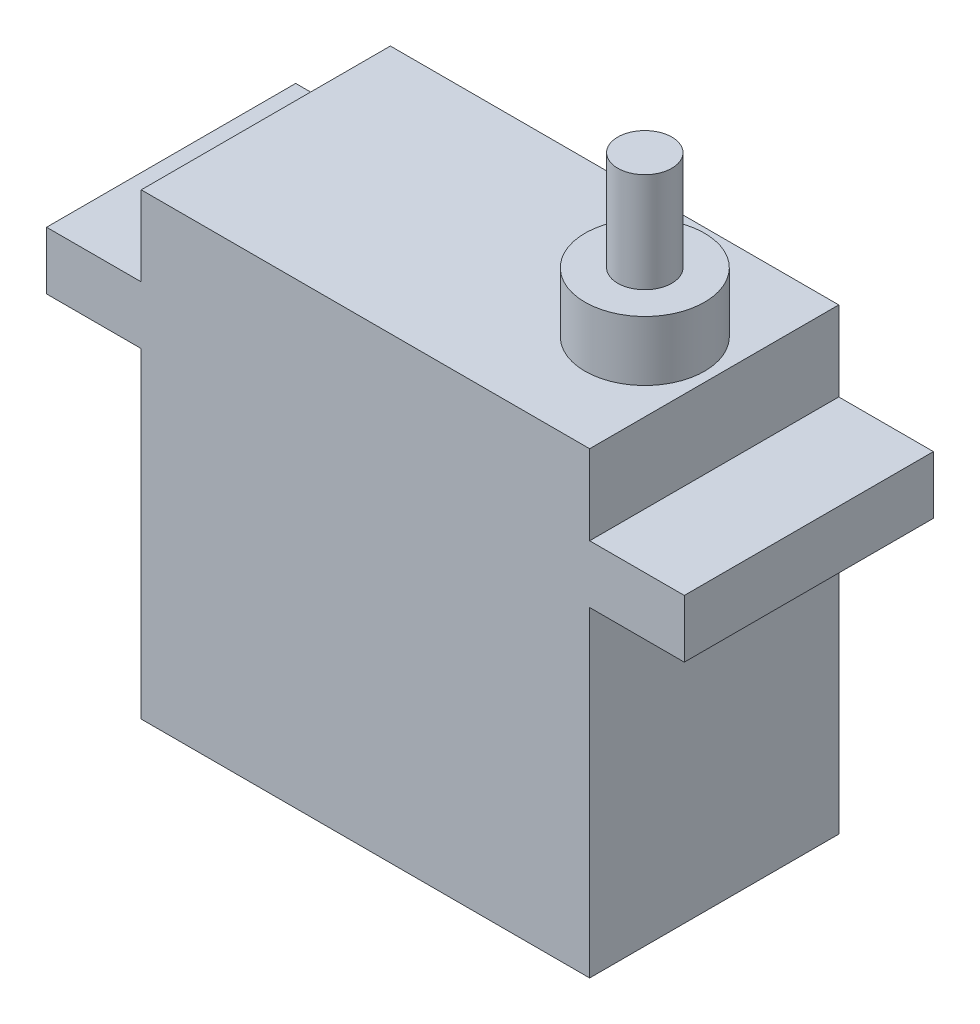
ISO-10303-21;
HEADER;
FILE_DESCRIPTION(('STEP AP214'),'2;1');
FILE_NAME('part.step','',(''),(''),'','','');
FILE_SCHEMA(('AUTOMOTIVE_DESIGN { 1 0 10303 214 1 1 1 1 }'));
ENDSEC;
DATA;
#1=APPLICATION_CONTEXT('core data for automotive mechanical design processes');
#2=APPLICATION_PROTOCOL_DEFINITION('international standard','automotive_design',2000,#1);
#3=PRODUCT_CONTEXT('',#1,'mechanical');
#4=PRODUCT('Part','Part','',(#3));
#5=PRODUCT_RELATED_PRODUCT_CATEGORY('part','',(#4));
#6=PRODUCT_DEFINITION_FORMATION('','',#4);
#7=PRODUCT_DEFINITION_CONTEXT('part definition',#1,'design');
#8=PRODUCT_DEFINITION('design','',#6,#7);
#9=PRODUCT_DEFINITION_SHAPE('','',#8);
#10=(LENGTH_UNIT() NAMED_UNIT(*) SI_UNIT(.MILLI.,.METRE.));
#11=(NAMED_UNIT(*) PLANE_ANGLE_UNIT() SI_UNIT($,.RADIAN.));
#12=(NAMED_UNIT(*) SI_UNIT($,.STERADIAN.) SOLID_ANGLE_UNIT());
#13=UNCERTAINTY_MEASURE_WITH_UNIT(LENGTH_MEASURE(1.E-05),#10,'distance_accuracy_value','');
#14=(GEOMETRIC_REPRESENTATION_CONTEXT(3) GLOBAL_UNCERTAINTY_ASSIGNED_CONTEXT((#13)) GLOBAL_UNIT_ASSIGNED_CONTEXT((#10,
#11,#12)) REPRESENTATION_CONTEXT('',''));
#15=CARTESIAN_POINT('',(0.,0.,0.));
#16=DIRECTION('',(0.,0.,1.));
#17=DIRECTION('',(1.,0.,0.));
#18=AXIS2_PLACEMENT_3D('',#15,#16,#17);
#19=CARTESIAN_POINT('',(16.,23.,6.25));
#20=DIRECTION('',(-1.,0.,0.));
#21=DIRECTION('',(0.,0.,1.));
#22=AXIS2_PLACEMENT_3D('',#19,#20,#21);
#23=PLANE('',#22);
#24=DIRECTION('',(0.,0.,1.));
#25=VECTOR('',#24,1.);
#26=CARTESIAN_POINT('',(16.,16.1,0.));
#27=LINE('',#26,#25);
#28=CARTESIAN_POINT('',(16.,16.1,-6.25));
#29=VERTEX_POINT('',#28);
#30=CARTESIAN_POINT('',(16.,16.1,6.25));
#31=VERTEX_POINT('',#30);
#32=EDGE_CURVE('E142',#29,#31,#27,.T.);
#33=ORIENTED_EDGE('',*,*,#32,.F.);
#34=DIRECTION('',(0.,-1.,0.));
#35=VECTOR('',#34,1.);
#36=CARTESIAN_POINT('',(16.,23.,-6.25));
#37=LINE('',#36,#35);
#38=CARTESIAN_POINT('',(16.,19.,-6.25));
#39=VERTEX_POINT('',#38);
#40=EDGE_CURVE('E253',#39,#29,#37,.T.);
#41=ORIENTED_EDGE('',*,*,#40,.F.);
#42=DIRECTION('',(0.,0.,-1.));
#43=VECTOR('',#42,1.);
#44=CARTESIAN_POINT('',(16.,19.,0.));
#45=LINE('',#44,#43);
#46=CARTESIAN_POINT('',(16.,19.,6.25));
#47=VERTEX_POINT('',#46);
#48=EDGE_CURVE('E221',#47,#39,#45,.T.);
#49=ORIENTED_EDGE('',*,*,#48,.F.);
#50=DIRECTION('',(0.,-1.,0.));
#51=VECTOR('',#50,1.);
#52=CARTESIAN_POINT('',(16.,23.,6.25));
#53=LINE('',#52,#51);
#54=EDGE_CURVE('E43',#47,#31,#53,.T.);
#55=ORIENTED_EDGE('',*,*,#54,.T.);
#56=EDGE_LOOP('',(#33,#41,#49,#55));
#57=FACE_BOUND('',#56,.T.);
#58=ADVANCED_FACE('F39',(#57),#23,.F.);
#59=CARTESIAN_POINT('',(-16.,23.,6.25));
#60=DIRECTION('',(-1.,0.,0.));
#61=DIRECTION('',(0.,0.,1.));
#62=AXIS2_PLACEMENT_3D('',#59,#60,#61);
#63=PLANE('',#62);
#64=DIRECTION('',(0.,-1.,0.));
#65=VECTOR('',#64,1.);
#66=CARTESIAN_POINT('',(-16.,23.,-6.25));
#67=LINE('',#66,#65);
#68=CARTESIAN_POINT('',(-16.,19.,-6.25));
#69=VERTEX_POINT('',#68);
#70=CARTESIAN_POINT('',(-16.,16.1,-6.25));
#71=VERTEX_POINT('',#70);
#72=EDGE_CURVE('E250',#69,#71,#67,.T.);
#73=ORIENTED_EDGE('',*,*,#72,.T.);
#74=DIRECTION('',(0.,0.,-1.));
#75=VECTOR('',#74,1.);
#76=CARTESIAN_POINT('',(-16.,16.1,0.));
#77=LINE('',#76,#75);
#78=CARTESIAN_POINT('',(-16.,16.1,6.25));
#79=VERTEX_POINT('',#78);
#80=EDGE_CURVE('E174',#79,#71,#77,.T.);
#81=ORIENTED_EDGE('',*,*,#80,.F.);
#82=DIRECTION('',(0.,-1.,0.));
#83=VECTOR('',#82,1.);
#84=CARTESIAN_POINT('',(-16.,23.,6.25));
#85=LINE('',#84,#83);
#86=CARTESIAN_POINT('',(-16.,19.,6.25));
#87=VERTEX_POINT('',#86);
#88=EDGE_CURVE('E241',#87,#79,#85,.T.);
#89=ORIENTED_EDGE('',*,*,#88,.F.);
#90=DIRECTION('',(0.,0.,1.));
#91=VECTOR('',#90,1.);
#92=CARTESIAN_POINT('',(-16.,19.,0.));
#93=LINE('',#92,#91);
#94=EDGE_CURVE('E192',#69,#87,#93,.T.);
#95=ORIENTED_EDGE('',*,*,#94,.F.);
#96=EDGE_LOOP('',(#73,#81,#89,#95));
#97=FACE_BOUND('',#96,.T.);
#98=ADVANCED_FACE('F288',(#97),#63,.T.);
#99=CARTESIAN_POINT('',(-16.,23.,6.25));
#100=DIRECTION('',(0.,0.,-1.));
#101=DIRECTION('',(-1.,0.,0.));
#102=AXIS2_PLACEMENT_3D('',#99,#100,#101);
#103=PLANE('',#102);
#104=DIRECTION('',(1.,0.,0.));
#105=VECTOR('',#104,1.);
#106=CARTESIAN_POINT('',(-16.,0.,6.25));
#107=LINE('',#106,#105);
#108=CARTESIAN_POINT('',(-11.25,0.,6.25));
#109=VERTEX_POINT('',#108);
#110=CARTESIAN_POINT('',(11.25,0.,6.25));
#111=VERTEX_POINT('',#110);
#112=EDGE_CURVE('E152',#109,#111,#107,.T.);
#113=ORIENTED_EDGE('',*,*,#112,.T.);
#114=DIRECTION('',(0.,-1.,0.));
#115=VECTOR('',#114,1.);
#116=CARTESIAN_POINT('',(11.25,16.1,6.25));
#117=LINE('',#116,#115);
#118=CARTESIAN_POINT('',(11.25,16.1,6.25));
#119=VERTEX_POINT('',#118);
#120=EDGE_CURVE('E64',#119,#111,#117,.T.);
#121=ORIENTED_EDGE('',*,*,#120,.F.);
#122=DIRECTION('',(-1.,0.,0.));
#123=VECTOR('',#122,1.);
#124=CARTESIAN_POINT('',(0.,16.1,6.25));
#125=LINE('',#124,#123);
#126=EDGE_CURVE('E137',#31,#119,#125,.T.);
#127=ORIENTED_EDGE('',*,*,#126,.F.);
#128=ORIENTED_EDGE('',*,*,#54,.F.);
#129=DIRECTION('',(1.,0.,0.));
#130=VECTOR('',#129,1.);
#131=CARTESIAN_POINT('',(0.,19.,6.25));
#132=LINE('',#131,#130);
#133=CARTESIAN_POINT('',(11.25,19.,6.25));
#134=VERTEX_POINT('',#133);
#135=EDGE_CURVE('E218',#134,#47,#132,.T.);
#136=ORIENTED_EDGE('',*,*,#135,.F.);
#137=DIRECTION('',(0.,1.,0.));
#138=VECTOR('',#137,1.);
#139=CARTESIAN_POINT('',(11.25,19.,6.25));
#140=LINE('',#139,#138);
#141=CARTESIAN_POINT('',(11.25,23.,6.25));
#142=VERTEX_POINT('',#141);
#143=EDGE_CURVE('E203',#134,#142,#140,.T.);
#144=ORIENTED_EDGE('',*,*,#143,.T.);
#145=DIRECTION('',(1.,0.,0.));
#146=VECTOR('',#145,1.);
#147=CARTESIAN_POINT('',(-16.,23.,6.25));
#148=LINE('',#147,#146);
#149=CARTESIAN_POINT('',(-11.25,23.,6.25));
#150=VERTEX_POINT('',#149);
#151=EDGE_CURVE('E232',#150,#142,#148,.T.);
#152=ORIENTED_EDGE('',*,*,#151,.F.);
#153=DIRECTION('',(0.,1.,0.));
#154=VECTOR('',#153,1.);
#155=CARTESIAN_POINT('',(-11.25,19.,6.25));
#156=LINE('',#155,#154);
#157=CARTESIAN_POINT('',(-11.25,19.,6.25));
#158=VERTEX_POINT('',#157);
#159=EDGE_CURVE('E204',#158,#150,#156,.T.);
#160=ORIENTED_EDGE('',*,*,#159,.F.);
#161=DIRECTION('',(1.,0.,0.));
#162=VECTOR('',#161,1.);
#163=CARTESIAN_POINT('',(0.,19.,6.25));
#164=LINE('',#163,#162);
#165=EDGE_CURVE('E195',#87,#158,#164,.T.);
#166=ORIENTED_EDGE('',*,*,#165,.F.);
#167=ORIENTED_EDGE('',*,*,#88,.T.);
#168=DIRECTION('',(-1.,0.,0.));
#169=VECTOR('',#168,1.);
#170=CARTESIAN_POINT('',(0.,16.1,6.25));
#171=LINE('',#170,#169);
#172=CARTESIAN_POINT('',(-11.25,16.1,6.25));
#173=VERTEX_POINT('',#172);
#174=EDGE_CURVE('E171',#173,#79,#171,.T.);
#175=ORIENTED_EDGE('',*,*,#174,.F.);
#176=DIRECTION('',(0.,-1.,0.));
#177=VECTOR('',#176,1.);
#178=CARTESIAN_POINT('',(-11.25,16.1,6.25));
#179=LINE('',#178,#177);
#180=EDGE_CURVE('E180',#173,#109,#179,.T.);
#181=ORIENTED_EDGE('',*,*,#180,.T.);
#182=EDGE_LOOP('',(#113,#121,#127,#128,#136,#144,#152,#160,#166,#167,#175,#181));
#183=FACE_BOUND('',#182,.T.);
#184=ADVANCED_FACE('F41',(#183),#103,.F.);
#185=CARTESIAN_POINT('',(-16.,23.,-6.25));
#186=DIRECTION('',(0.,0.,-1.));
#187=DIRECTION('',(-1.,0.,0.));
#188=AXIS2_PLACEMENT_3D('',#185,#186,#187);
#189=PLANE('',#188);
#190=DIRECTION('',(0.,-1.,0.));
#191=VECTOR('',#190,1.);
#192=CARTESIAN_POINT('',(11.25,16.1,-6.25));
#193=LINE('',#192,#191);
#194=CARTESIAN_POINT('',(11.25,16.1,-6.25));
#195=VERTEX_POINT('',#194);
#196=CARTESIAN_POINT('',(11.25,0.,-6.25));
#197=VERTEX_POINT('',#196);
#198=EDGE_CURVE('E132',#195,#197,#193,.T.);
#199=ORIENTED_EDGE('',*,*,#198,.T.);
#200=DIRECTION('',(1.,0.,0.));
#201=VECTOR('',#200,1.);
#202=CARTESIAN_POINT('',(-16.,0.,-6.25));
#203=LINE('',#202,#201);
#204=CARTESIAN_POINT('',(-11.25,0.,-6.25));
#205=VERTEX_POINT('',#204);
#206=EDGE_CURVE('E237',#205,#197,#203,.T.);
#207=ORIENTED_EDGE('',*,*,#206,.F.);
#208=DIRECTION('',(0.,-1.,0.));
#209=VECTOR('',#208,1.);
#210=CARTESIAN_POINT('',(-11.25,16.1,-6.25));
#211=LINE('',#210,#209);
#212=CARTESIAN_POINT('',(-11.25,16.1,-6.25));
#213=VERTEX_POINT('',#212);
#214=EDGE_CURVE('E56',#213,#205,#211,.T.);
#215=ORIENTED_EDGE('',*,*,#214,.F.);
#216=DIRECTION('',(1.,0.,0.));
#217=VECTOR('',#216,1.);
#218=CARTESIAN_POINT('',(0.,16.1,-6.25));
#219=LINE('',#218,#217);
#220=EDGE_CURVE('E162',#71,#213,#219,.T.);
#221=ORIENTED_EDGE('',*,*,#220,.F.);
#222=ORIENTED_EDGE('',*,*,#72,.F.);
#223=DIRECTION('',(-1.,0.,0.));
#224=VECTOR('',#223,1.);
#225=CARTESIAN_POINT('',(0.,19.,-6.25));
#226=LINE('',#225,#224);
#227=CARTESIAN_POINT('',(-11.25,19.,-6.25));
#228=VERTEX_POINT('',#227);
#229=EDGE_CURVE('E188',#228,#69,#226,.T.);
#230=ORIENTED_EDGE('',*,*,#229,.F.);
#231=DIRECTION('',(0.,1.,0.));
#232=VECTOR('',#231,1.);
#233=CARTESIAN_POINT('',(-11.25,19.,-6.25));
#234=LINE('',#233,#232);
#235=CARTESIAN_POINT('',(-11.25,23.,-6.25));
#236=VERTEX_POINT('',#235);
#237=EDGE_CURVE('E199',#228,#236,#234,.T.);
#238=ORIENTED_EDGE('',*,*,#237,.T.);
#239=DIRECTION('',(1.,0.,0.));
#240=VECTOR('',#239,1.);
#241=CARTESIAN_POINT('',(-16.,23.,-6.25));
#242=LINE('',#241,#240);
#243=CARTESIAN_POINT('',(11.25,23.,-6.25));
#244=VERTEX_POINT('',#243);
#245=EDGE_CURVE('E236',#236,#244,#242,.T.);
#246=ORIENTED_EDGE('',*,*,#245,.T.);
#247=DIRECTION('',(0.,1.,0.));
#248=VECTOR('',#247,1.);
#249=CARTESIAN_POINT('',(11.25,19.,-6.25));
#250=LINE('',#249,#248);
#251=CARTESIAN_POINT('',(11.25,19.,-6.25));
#252=VERTEX_POINT('',#251);
#253=EDGE_CURVE('E224',#252,#244,#250,.T.);
#254=ORIENTED_EDGE('',*,*,#253,.F.);
#255=DIRECTION('',(-1.,0.,0.));
#256=VECTOR('',#255,1.);
#257=CARTESIAN_POINT('',(0.,19.,-6.25));
#258=LINE('',#257,#256);
#259=EDGE_CURVE('E210',#39,#252,#258,.T.);
#260=ORIENTED_EDGE('',*,*,#259,.F.);
#261=ORIENTED_EDGE('',*,*,#40,.T.);
#262=DIRECTION('',(1.,0.,0.));
#263=VECTOR('',#262,1.);
#264=CARTESIAN_POINT('',(0.,16.1,-6.25));
#265=LINE('',#264,#263);
#266=EDGE_CURVE('E136',#195,#29,#265,.T.);
#267=ORIENTED_EDGE('',*,*,#266,.F.);
#268=EDGE_LOOP('',(#199,#207,#215,#221,#222,#230,#238,#246,#254,#260,#261,#267));
#269=FACE_BOUND('',#268,.T.);
#270=ADVANCED_FACE('F273',(#269),#189,.T.);
#271=CARTESIAN_POINT('',(0.,23.,0.));
#272=DIRECTION('',(0.,1.,0.));
#273=DIRECTION('',(0.,0.,1.));
#274=AXIS2_PLACEMENT_3D('',#271,#272,#273);
#275=PLANE('',#274);
#276=CARTESIAN_POINT('',(7.76695559267217,23.,0.));
#277=DIRECTION('',(0.,1.,0.));
#278=DIRECTION('',(0.,0.,1.));
#279=AXIS2_PLACEMENT_3D('',#276,#277,#278);
#280=CIRCLE('',#279,3.);
#281=CARTESIAN_POINT('',(7.76695559267217,23.,3.));
#282=VERTEX_POINT('',#281);
#283=EDGE_CURVE('E440',#282,#282,#280,.T.);
#284=ORIENTED_EDGE('',*,*,#283,.F.);
#285=EDGE_LOOP('',(#284));
#286=FACE_BOUND('',#285,.T.);
#287=ORIENTED_EDGE('',*,*,#245,.F.);
#288=DIRECTION('',(0.,0.,1.));
#289=VECTOR('',#288,1.);
#290=CARTESIAN_POINT('',(-11.25,23.,0.));
#291=LINE('',#290,#289);
#292=EDGE_CURVE('E189',#236,#150,#291,.T.);
#293=ORIENTED_EDGE('',*,*,#292,.T.);
#294=ORIENTED_EDGE('',*,*,#151,.T.);
#295=DIRECTION('',(0.,0.,1.));
#296=VECTOR('',#295,1.);
#297=CARTESIAN_POINT('',(11.25,23.,0.));
#298=LINE('',#297,#296);
#299=EDGE_CURVE('E157',#244,#142,#298,.T.);
#300=ORIENTED_EDGE('',*,*,#299,.F.);
#301=EDGE_LOOP('',(#287,#293,#294,#300));
#302=FACE_BOUND('',#301,.T.);
#303=ADVANCED_FACE('F272',(#286,#302),#275,.T.);
#304=CARTESIAN_POINT('',(0.,0.,0.));
#305=DIRECTION('',(0.,1.,0.));
#306=DIRECTION('',(0.,0.,1.));
#307=AXIS2_PLACEMENT_3D('',#304,#305,#306);
#308=PLANE('',#307);
#309=ORIENTED_EDGE('',*,*,#206,.T.);
#310=DIRECTION('',(0.,0.,-1.));
#311=VECTOR('',#310,1.);
#312=CARTESIAN_POINT('',(11.25,0.,0.));
#313=LINE('',#312,#311);
#314=EDGE_CURVE('E147',#111,#197,#313,.T.);
#315=ORIENTED_EDGE('',*,*,#314,.F.);
#316=ORIENTED_EDGE('',*,*,#112,.F.);
#317=DIRECTION('',(0.,0.,1.));
#318=VECTOR('',#317,1.);
#319=CARTESIAN_POINT('',(-11.25,0.,0.));
#320=LINE('',#319,#318);
#321=EDGE_CURVE('E167',#205,#109,#320,.T.);
#322=ORIENTED_EDGE('',*,*,#321,.F.);
#323=EDGE_LOOP('',(#309,#315,#316,#322));
#324=FACE_BOUND('',#323,.T.);
#325=ADVANCED_FACE('F294',(#324),#308,.F.);
#326=CARTESIAN_POINT('',(11.25,19.,0.));
#327=DIRECTION('',(-1.,0.,0.));
#328=DIRECTION('',(0.,0.,1.));
#329=AXIS2_PLACEMENT_3D('',#326,#327,#328);
#330=PLANE('',#329);
#331=ORIENTED_EDGE('',*,*,#299,.T.);
#332=ORIENTED_EDGE('',*,*,#143,.F.);
#333=DIRECTION('',(0.,0.,1.));
#334=VECTOR('',#333,1.);
#335=CARTESIAN_POINT('',(11.25,19.,0.));
#336=LINE('',#335,#334);
#337=EDGE_CURVE('E214',#252,#134,#336,.T.);
#338=ORIENTED_EDGE('',*,*,#337,.F.);
#339=ORIENTED_EDGE('',*,*,#253,.T.);
#340=EDGE_LOOP('',(#331,#332,#338,#339));
#341=FACE_BOUND('',#340,.T.);
#342=ADVANCED_FACE('F268',(#341),#330,.F.);
#343=CARTESIAN_POINT('',(0.,19.,0.));
#344=DIRECTION('',(0.,1.,0.));
#345=DIRECTION('',(0.,0.,1.));
#346=AXIS2_PLACEMENT_3D('',#343,#344,#345);
#347=PLANE('',#346);
#348=ORIENTED_EDGE('',*,*,#259,.T.);
#349=ORIENTED_EDGE('',*,*,#337,.T.);
#350=ORIENTED_EDGE('',*,*,#135,.T.);
#351=ORIENTED_EDGE('',*,*,#48,.T.);
#352=EDGE_LOOP('',(#348,#349,#350,#351));
#353=FACE_BOUND('',#352,.T.);
#354=ADVANCED_FACE('F265',(#353),#347,.T.);
#355=CARTESIAN_POINT('',(-11.25,19.,0.));
#356=DIRECTION('',(-1.,0.,0.));
#357=DIRECTION('',(0.,0.,1.));
#358=AXIS2_PLACEMENT_3D('',#355,#356,#357);
#359=PLANE('',#358);
#360=ORIENTED_EDGE('',*,*,#292,.F.);
#361=ORIENTED_EDGE('',*,*,#237,.F.);
#362=DIRECTION('',(0.,0.,1.));
#363=VECTOR('',#362,1.);
#364=CARTESIAN_POINT('',(-11.25,19.,0.));
#365=LINE('',#364,#363);
#366=EDGE_CURVE('E185',#228,#158,#365,.T.);
#367=ORIENTED_EDGE('',*,*,#366,.T.);
#368=ORIENTED_EDGE('',*,*,#159,.T.);
#369=EDGE_LOOP('',(#360,#361,#367,#368));
#370=FACE_BOUND('',#369,.T.);
#371=ADVANCED_FACE('F278',(#370),#359,.T.);
#372=CARTESIAN_POINT('',(0.,19.,0.));
#373=DIRECTION('',(0.,1.,0.));
#374=DIRECTION('',(0.,0.,1.));
#375=AXIS2_PLACEMENT_3D('',#372,#373,#374);
#376=PLANE('',#375);
#377=ORIENTED_EDGE('',*,*,#366,.F.);
#378=ORIENTED_EDGE('',*,*,#229,.T.);
#379=ORIENTED_EDGE('',*,*,#94,.T.);
#380=ORIENTED_EDGE('',*,*,#165,.T.);
#381=EDGE_LOOP('',(#377,#378,#379,#380));
#382=FACE_BOUND('',#381,.T.);
#383=ADVANCED_FACE('F280',(#382),#376,.T.);
#384=CARTESIAN_POINT('',(-11.25,16.1,0.));
#385=DIRECTION('',(1.,0.,0.));
#386=DIRECTION('',(0.,0.,-1.));
#387=AXIS2_PLACEMENT_3D('',#384,#385,#386);
#388=PLANE('',#387);
#389=ORIENTED_EDGE('',*,*,#321,.T.);
#390=ORIENTED_EDGE('',*,*,#180,.F.);
#391=DIRECTION('',(0.,0.,1.));
#392=VECTOR('',#391,1.);
#393=CARTESIAN_POINT('',(-11.25,16.1,0.));
#394=LINE('',#393,#392);
#395=EDGE_CURVE('E166',#213,#173,#394,.T.);
#396=ORIENTED_EDGE('',*,*,#395,.F.);
#397=ORIENTED_EDGE('',*,*,#214,.T.);
#398=EDGE_LOOP('',(#389,#390,#396,#397));
#399=FACE_BOUND('',#398,.T.);
#400=ADVANCED_FACE('F295',(#399),#388,.F.);
#401=CARTESIAN_POINT('',(0.,16.1,0.));
#402=DIRECTION('',(0.,-1.,0.));
#403=DIRECTION('',(0.,0.,-1.));
#404=AXIS2_PLACEMENT_3D('',#401,#402,#403);
#405=PLANE('',#404);
#406=ORIENTED_EDGE('',*,*,#220,.T.);
#407=ORIENTED_EDGE('',*,*,#395,.T.);
#408=ORIENTED_EDGE('',*,*,#174,.T.);
#409=ORIENTED_EDGE('',*,*,#80,.T.);
#410=EDGE_LOOP('',(#406,#407,#408,#409));
#411=FACE_BOUND('',#410,.T.);
#412=ADVANCED_FACE('F291',(#411),#405,.T.);
#413=CARTESIAN_POINT('',(11.25,16.1,0.));
#414=DIRECTION('',(-1.,0.,0.));
#415=DIRECTION('',(0.,0.,1.));
#416=AXIS2_PLACEMENT_3D('',#413,#414,#415);
#417=PLANE('',#416);
#418=ORIENTED_EDGE('',*,*,#314,.T.);
#419=ORIENTED_EDGE('',*,*,#198,.F.);
#420=DIRECTION('',(0.,0.,-1.));
#421=VECTOR('',#420,1.);
#422=CARTESIAN_POINT('',(11.25,16.1,0.));
#423=LINE('',#422,#421);
#424=EDGE_CURVE('E128',#119,#195,#423,.T.);
#425=ORIENTED_EDGE('',*,*,#424,.F.);
#426=ORIENTED_EDGE('',*,*,#120,.T.);
#427=EDGE_LOOP('',(#418,#419,#425,#426));
#428=FACE_BOUND('',#427,.T.);
#429=ADVANCED_FACE('F130',(#428),#417,.F.);
#430=CARTESIAN_POINT('',(0.,16.1,0.));
#431=DIRECTION('',(0.,-1.,0.));
#432=DIRECTION('',(0.,0.,-1.));
#433=AXIS2_PLACEMENT_3D('',#430,#431,#432);
#434=PLANE('',#433);
#435=ORIENTED_EDGE('',*,*,#126,.T.);
#436=ORIENTED_EDGE('',*,*,#424,.T.);
#437=ORIENTED_EDGE('',*,*,#266,.T.);
#438=ORIENTED_EDGE('',*,*,#32,.T.);
#439=EDGE_LOOP('',(#435,#436,#437,#438));
#440=FACE_BOUND('',#439,.T.);
#441=ADVANCED_FACE('F140',(#440),#434,.T.);
#442=CARTESIAN_POINT('',(7.76695559267217,26.,0.));
#443=DIRECTION('',(0.,-1.,0.));
#444=DIRECTION('',(0.,0.,-1.));
#445=AXIS2_PLACEMENT_3D('',#442,#443,#444);
#446=CYLINDRICAL_SURFACE('',#445,3.);
#447=CARTESIAN_POINT('',(7.76695559267217,26.,0.));
#448=DIRECTION('',(0.,1.,0.));
#449=DIRECTION('',(0.,0.,1.));
#450=AXIS2_PLACEMENT_3D('',#447,#448,#449);
#451=CIRCLE('',#450,3.);
#452=CARTESIAN_POINT('',(7.76695559267217,26.,3.));
#453=VERTEX_POINT('',#452);
#454=EDGE_CURVE('E179',#453,#453,#451,.T.);
#455=ORIENTED_EDGE('',*,*,#454,.F.);
#456=EDGE_LOOP('',(#455));
#457=FACE_BOUND('',#456,.T.);
#458=ORIENTED_EDGE('',*,*,#283,.T.);
#459=EDGE_LOOP('',(#458));
#460=FACE_BOUND('',#459,.T.);
#461=ADVANCED_FACE('F388',(#457,#460),#446,.T.);
#462=CARTESIAN_POINT('',(7.76695559267217,26.,0.));
#463=DIRECTION('',(0.,1.,0.));
#464=DIRECTION('',(0.,0.,1.));
#465=AXIS2_PLACEMENT_3D('',#462,#463,#464);
#466=PLANE('',#465);
#467=CARTESIAN_POINT('',(7.76695559267217,26.,0.));
#468=DIRECTION('',(0.,1.,0.));
#469=DIRECTION('',(0.,0.,1.));
#470=AXIS2_PLACEMENT_3D('',#467,#468,#469);
#471=CIRCLE('',#470,1.35677098636116);
#472=CARTESIAN_POINT('',(7.76695559267217,26.,1.35677098636116));
#473=VERTEX_POINT('',#472);
#474=EDGE_CURVE('E11',#473,#473,#471,.T.);
#475=ORIENTED_EDGE('',*,*,#474,.F.);
#476=EDGE_LOOP('',(#475));
#477=FACE_BOUND('',#476,.T.);
#478=ORIENTED_EDGE('',*,*,#454,.T.);
#479=EDGE_LOOP('',(#478));
#480=FACE_BOUND('',#479,.T.);
#481=ADVANCED_FACE('F402',(#477,#480),#466,.T.);
#482=CARTESIAN_POINT('',(7.76695559267217,31.,0.));
#483=DIRECTION('',(0.,-1.,0.));
#484=DIRECTION('',(0.,0.,-1.));
#485=AXIS2_PLACEMENT_3D('',#482,#483,#484);
#486=CYLINDRICAL_SURFACE('',#485,1.35677098636116);
#487=CARTESIAN_POINT('',(7.76695559267217,31.,0.));
#488=DIRECTION('',(0.,1.,0.));
#489=DIRECTION('',(0.,0.,1.));
#490=AXIS2_PLACEMENT_3D('',#487,#488,#489);
#491=CIRCLE('',#490,1.35677098636116);
#492=CARTESIAN_POINT('',(7.76695559267217,31.,1.35677098636116));
#493=VERTEX_POINT('',#492);
#494=EDGE_CURVE('E438',#493,#493,#491,.T.);
#495=ORIENTED_EDGE('',*,*,#494,.F.);
#496=EDGE_LOOP('',(#495));
#497=FACE_BOUND('',#496,.T.);
#498=ORIENTED_EDGE('',*,*,#474,.T.);
#499=EDGE_LOOP('',(#498));
#500=FACE_BOUND('',#499,.T.);
#501=ADVANCED_FACE('F412',(#497,#500),#486,.T.);
#502=CARTESIAN_POINT('',(7.76695559267217,31.,0.));
#503=DIRECTION('',(0.,1.,0.));
#504=DIRECTION('',(0.,0.,1.));
#505=AXIS2_PLACEMENT_3D('',#502,#503,#504);
#506=PLANE('',#505);
#507=ORIENTED_EDGE('',*,*,#494,.T.);
#508=EDGE_LOOP('',(#507));
#509=FACE_BOUND('',#508,.T.);
#510=ADVANCED_FACE('F422',(#509),#506,.T.);
#511=CLOSED_SHELL('',(#58,#98,#184,#270,#303,#325,#342,#354,#371,#383,#400,#412,#429,#441,#461,
#481,#501,#510));
#512=MANIFOLD_SOLID_BREP('B2',#511);
#513=ADVANCED_BREP_SHAPE_REPRESENTATION('',(#18,#512),#14);
#514=SHAPE_DEFINITION_REPRESENTATION(#9,#513);
ENDSEC;
END-ISO-10303-21;
